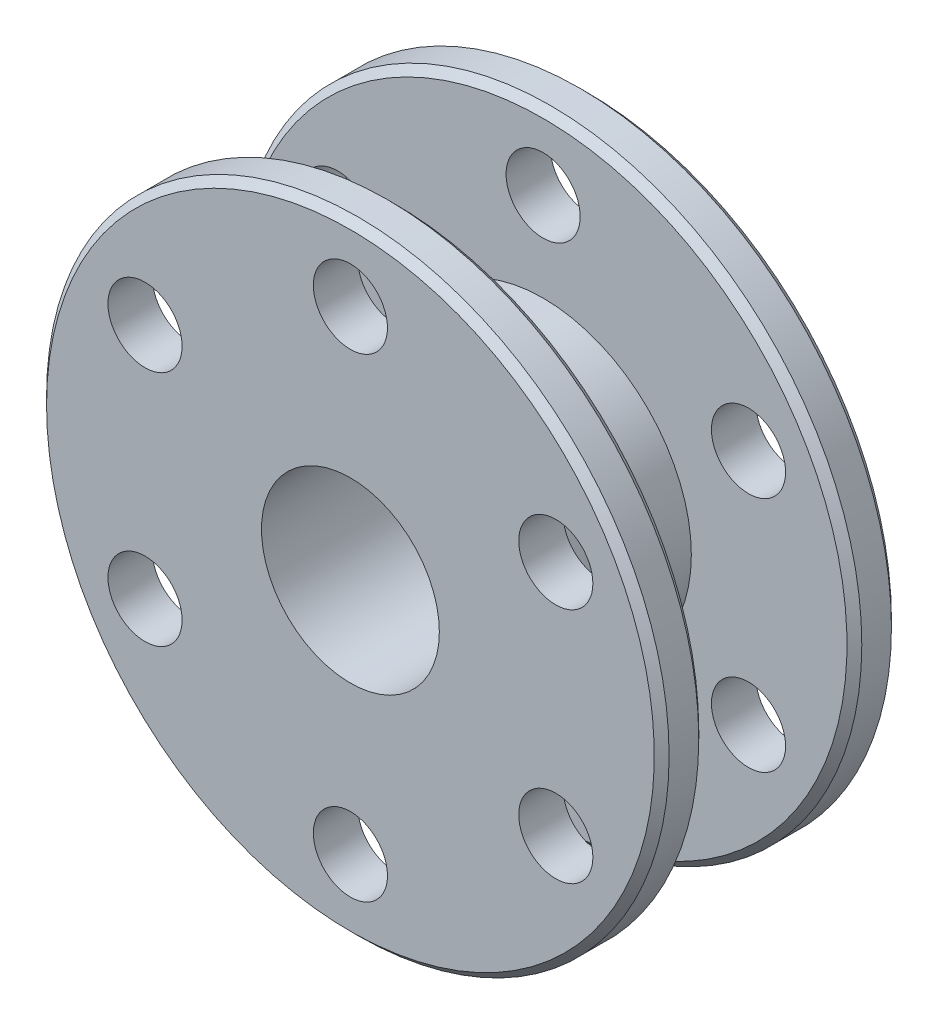
ISO-10303-21;
HEADER;
FILE_DESCRIPTION(('STEP AP214'),'2;1');
FILE_NAME('part.step','',(''),(''),'','','');
FILE_SCHEMA(('AUTOMOTIVE_DESIGN { 1 0 10303 214 1 1 1 1 }'));
ENDSEC;
DATA;
#1=APPLICATION_CONTEXT('core data for automotive mechanical design processes');
#2=APPLICATION_PROTOCOL_DEFINITION('international standard','automotive_design',2000,#1);
#3=PRODUCT_CONTEXT('',#1,'mechanical');
#4=PRODUCT('Part','Part','',(#3));
#5=PRODUCT_RELATED_PRODUCT_CATEGORY('part','',(#4));
#6=PRODUCT_DEFINITION_FORMATION('','',#4);
#7=PRODUCT_DEFINITION_CONTEXT('part definition',#1,'design');
#8=PRODUCT_DEFINITION('design','',#6,#7);
#9=PRODUCT_DEFINITION_SHAPE('','',#8);
#10=(LENGTH_UNIT() NAMED_UNIT(*) SI_UNIT(.MILLI.,.METRE.));
#11=(NAMED_UNIT(*) PLANE_ANGLE_UNIT() SI_UNIT($,.RADIAN.));
#12=(NAMED_UNIT(*) SI_UNIT($,.STERADIAN.) SOLID_ANGLE_UNIT());
#13=UNCERTAINTY_MEASURE_WITH_UNIT(LENGTH_MEASURE(1.E-05),#10,'distance_accuracy_value','');
#14=(GEOMETRIC_REPRESENTATION_CONTEXT(3) GLOBAL_UNCERTAINTY_ASSIGNED_CONTEXT((#13)) GLOBAL_UNIT_ASSIGNED_CONTEXT((#10,
#11,#12)) REPRESENTATION_CONTEXT('',''));
#15=CARTESIAN_POINT('',(0.,0.,0.));
#16=DIRECTION('',(0.,0.,1.));
#17=DIRECTION('',(1.,0.,0.));
#18=AXIS2_PLACEMENT_3D('',#15,#16,#17);
#19=CARTESIAN_POINT('',(0.,0.,24.7906816225651));
#20=DIRECTION('',(0.,0.,1.));
#21=DIRECTION('',(1.,0.,0.));
#22=AXIS2_PLACEMENT_3D('',#19,#20,#21);
#23=CYLINDRICAL_SURFACE('',#22,6.);
#24=CARTESIAN_POINT('',(0.,0.,-2.75139856854908));
#25=DIRECTION('',(0.,0.,1.));
#26=DIRECTION('',(1.,0.,0.));
#27=AXIS2_PLACEMENT_3D('',#24,#25,#26);
#28=CIRCLE('',#27,6.);
#29=CARTESIAN_POINT('',(6.,0.,-2.75139856854908));
#30=VERTEX_POINT('',#29);
#31=EDGE_CURVE('E77',#30,#30,#28,.T.);
#32=ORIENTED_EDGE('',*,*,#31,.F.);
#33=EDGE_LOOP('',(#32));
#34=FACE_BOUND('',#33,.T.);
#35=CARTESIAN_POINT('',(0.,0.,13.2486014314509));
#36=DIRECTION('',(0.,0.,1.));
#37=DIRECTION('',(1.,0.,0.));
#38=AXIS2_PLACEMENT_3D('',#35,#36,#37);
#39=CIRCLE('',#38,6.);
#40=CARTESIAN_POINT('',(6.,0.,13.2486014314509));
#41=VERTEX_POINT('',#40);
#42=EDGE_CURVE('E68',#41,#41,#39,.T.);
#43=ORIENTED_EDGE('',*,*,#42,.T.);
#44=EDGE_LOOP('',(#43));
#45=FACE_BOUND('',#44,.T.);
#46=ADVANCED_FACE('F35',(#34,#45),#23,.F.);
#47=CARTESIAN_POINT('',(0.,6.,13.2486014314509));
#48=DIRECTION('',(0.,0.,-1.));
#49=DIRECTION('',(-1.,0.,0.));
#50=AXIS2_PLACEMENT_3D('',#47,#48,#49);
#51=PLANE('',#50);
#52=CARTESIAN_POINT('',(0.,16.,13.2486014314509));
#53=DIRECTION('',(0.,0.,-1.));
#54=DIRECTION('',(-1.,0.,0.));
#55=AXIS2_PLACEMENT_3D('',#52,#53,#54);
#56=CIRCLE('',#55,2.5);
#57=CARTESIAN_POINT('',(-2.5,16.,13.2486014314509));
#58=VERTEX_POINT('',#57);
#59=EDGE_CURVE('E80',#58,#58,#56,.T.);
#60=ORIENTED_EDGE('',*,*,#59,.T.);
#61=EDGE_LOOP('',(#60));
#62=FACE_BOUND('',#61,.T.);
#63=CARTESIAN_POINT('',(-13.8564064605508,7.9999999999996,13.2486014314509));
#64=DIRECTION('',(0.,0.,-1.));
#65=DIRECTION('',(-1.,0.,0.));
#66=AXIS2_PLACEMENT_3D('',#63,#64,#65);
#67=CIRCLE('',#66,2.50000000000052);
#68=CARTESIAN_POINT('',(-16.3564064605513,7.9999999999996,13.2486014314509));
#69=VERTEX_POINT('',#68);
#70=EDGE_CURVE('E89',#69,#69,#67,.T.);
#71=ORIENTED_EDGE('',*,*,#70,.T.);
#72=EDGE_LOOP('',(#71));
#73=FACE_BOUND('',#72,.T.);
#74=CARTESIAN_POINT('',(-13.8564064605503,-8.0000000000004,13.2486014314509));
#75=DIRECTION('',(0.,0.,-1.));
#76=DIRECTION('',(-1.,0.,0.));
#77=AXIS2_PLACEMENT_3D('',#74,#75,#76);
#78=CIRCLE('',#77,2.50000000000091);
#79=CARTESIAN_POINT('',(-16.3564064605513,-8.0000000000004,13.2486014314509));
#80=VERTEX_POINT('',#79);
#81=EDGE_CURVE('E98',#80,#80,#78,.T.);
#82=ORIENTED_EDGE('',*,*,#81,.T.);
#83=EDGE_LOOP('',(#82));
#84=FACE_BOUND('',#83,.T.);
#85=CARTESIAN_POINT('',(9.03616397137021E-13,-16.,13.2486014314509));
#86=DIRECTION('',(0.,0.,-1.));
#87=DIRECTION('',(-1.,0.,0.));
#88=AXIS2_PLACEMENT_3D('',#85,#86,#87);
#89=CIRCLE('',#88,2.50000000000097);
#90=CARTESIAN_POINT('',(-2.50000000000007,-16.,13.2486014314509));
#91=VERTEX_POINT('',#90);
#92=EDGE_CURVE('E107',#91,#91,#89,.T.);
#93=ORIENTED_EDGE('',*,*,#92,.T.);
#94=EDGE_LOOP('',(#93));
#95=FACE_BOUND('',#94,.T.);
#96=CARTESIAN_POINT('',(13.8564064605517,-7.99999999999961,13.2486014314509));
#97=DIRECTION('',(0.,0.,-1.));
#98=DIRECTION('',(-1.,0.,0.));
#99=AXIS2_PLACEMENT_3D('',#96,#97,#98);
#100=CIRCLE('',#99,2.50000000000061);
#101=CARTESIAN_POINT('',(11.3564064605511,-7.99999999999961,13.2486014314509));
#102=VERTEX_POINT('',#101);
#103=EDGE_CURVE('E116',#102,#102,#100,.T.);
#104=ORIENTED_EDGE('',*,*,#103,.T.);
#105=EDGE_LOOP('',(#104));
#106=FACE_BOUND('',#105,.T.);
#107=CARTESIAN_POINT('',(13.8564064605512,8.0000000000004,13.2486014314509));
#108=DIRECTION('',(0.,0.,-1.));
#109=DIRECTION('',(-1.,0.,0.));
#110=AXIS2_PLACEMENT_3D('',#107,#108,#109);
#111=CIRCLE('',#110,2.50000000000014);
#112=CARTESIAN_POINT('',(11.3564064605511,8.0000000000004,13.2486014314509));
#113=VERTEX_POINT('',#112);
#114=EDGE_CURVE('E125',#113,#113,#111,.T.);
#115=ORIENTED_EDGE('',*,*,#114,.T.);
#116=EDGE_LOOP('',(#115));
#117=FACE_BOUND('',#116,.T.);
#118=CARTESIAN_POINT('',(0.,0.,13.2486014314509));
#119=DIRECTION('',(0.,0.,-1.));
#120=DIRECTION('',(-1.,0.,0.));
#121=AXIS2_PLACEMENT_3D('',#118,#119,#120);
#122=CIRCLE('',#121,20.5);
#123=CARTESIAN_POINT('',(-20.5,0.,13.2486014314509));
#124=VERTEX_POINT('',#123);
#125=EDGE_CURVE('E10',#124,#124,#122,.F.);
#126=ORIENTED_EDGE('',*,*,#125,.T.);
#127=EDGE_LOOP('',(#126));
#128=FACE_BOUND('',#127,.T.);
#129=ORIENTED_EDGE('',*,*,#42,.F.);
#130=EDGE_LOOP('',(#129));
#131=FACE_BOUND('',#130,.T.);
#132=ADVANCED_FACE('F197',(#62,#73,#84,#95,#106,#117,#128,#131),#51,.F.);
#133=CARTESIAN_POINT('',(0.,0.,24.7906816225651));
#134=DIRECTION('',(0.,0.,1.));
#135=DIRECTION('',(1.,0.,0.));
#136=AXIS2_PLACEMENT_3D('',#133,#134,#135);
#137=CYLINDRICAL_SURFACE('',#136,21.);
#138=CARTESIAN_POINT('',(0.,0.,10.7486014314509));
#139=DIRECTION('',(0.,0.,1.));
#140=DIRECTION('',(1.,0.,0.));
#141=AXIS2_PLACEMENT_3D('',#138,#139,#140);
#142=CIRCLE('',#141,21.);
#143=CARTESIAN_POINT('',(21.,0.,10.7486014314509));
#144=VERTEX_POINT('',#143);
#145=EDGE_CURVE('E47',#144,#144,#142,.T.);
#146=ORIENTED_EDGE('',*,*,#145,.T.);
#147=EDGE_LOOP('',(#146));
#148=FACE_BOUND('',#147,.T.);
#149=CARTESIAN_POINT('',(0.,0.,12.7486014314509));
#150=DIRECTION('',(0.,0.,-1.));
#151=DIRECTION('',(-1.,0.,0.));
#152=AXIS2_PLACEMENT_3D('',#149,#150,#151);
#153=CIRCLE('',#152,21.);
#154=CARTESIAN_POINT('',(-21.,0.,12.7486014314509));
#155=VERTEX_POINT('',#154);
#156=EDGE_CURVE('E51',#155,#155,#153,.T.);
#157=ORIENTED_EDGE('',*,*,#156,.T.);
#158=EDGE_LOOP('',(#157));
#159=FACE_BOUND('',#158,.T.);
#160=ADVANCED_FACE('F192',(#148,#159),#137,.T.);
#161=CARTESIAN_POINT('',(0.,21.,10.2486014314509));
#162=DIRECTION('',(0.,0.,1.));
#163=DIRECTION('',(1.,0.,0.));
#164=AXIS2_PLACEMENT_3D('',#161,#162,#163);
#165=PLANE('',#164);
#166=CARTESIAN_POINT('',(0.,16.,10.2486014314509));
#167=DIRECTION('',(0.,0.,1.));
#168=DIRECTION('',(1.,0.,0.));
#169=AXIS2_PLACEMENT_3D('',#166,#167,#168);
#170=CIRCLE('',#169,2.5);
#171=CARTESIAN_POINT('',(2.5,16.,10.2486014314509));
#172=VERTEX_POINT('',#171);
#173=EDGE_CURVE('E83',#172,#172,#170,.T.);
#174=ORIENTED_EDGE('',*,*,#173,.T.);
#175=EDGE_LOOP('',(#174));
#176=FACE_BOUND('',#175,.T.);
#177=CARTESIAN_POINT('',(-13.8564064605508,7.9999999999996,10.2486014314509));
#178=DIRECTION('',(0.,0.,1.));
#179=DIRECTION('',(1.,0.,0.));
#180=AXIS2_PLACEMENT_3D('',#177,#178,#179);
#181=CIRCLE('',#180,2.50000000000052);
#182=CARTESIAN_POINT('',(-11.3564064605503,7.9999999999996,10.2486014314509));
#183=VERTEX_POINT('',#182);
#184=EDGE_CURVE('E92',#183,#183,#181,.T.);
#185=ORIENTED_EDGE('',*,*,#184,.T.);
#186=EDGE_LOOP('',(#185));
#187=FACE_BOUND('',#186,.T.);
#188=CARTESIAN_POINT('',(-13.8564064605503,-8.0000000000004,10.2486014314509));
#189=DIRECTION('',(0.,0.,1.));
#190=DIRECTION('',(1.,0.,0.));
#191=AXIS2_PLACEMENT_3D('',#188,#189,#190);
#192=CIRCLE('',#191,2.50000000000091);
#193=CARTESIAN_POINT('',(-11.3564064605494,-8.0000000000004,10.2486014314509));
#194=VERTEX_POINT('',#193);
#195=EDGE_CURVE('E101',#194,#194,#192,.T.);
#196=ORIENTED_EDGE('',*,*,#195,.T.);
#197=EDGE_LOOP('',(#196));
#198=FACE_BOUND('',#197,.T.);
#199=CARTESIAN_POINT('',(9.03616397137021E-13,-16.,10.2486014314509));
#200=DIRECTION('',(0.,0.,1.));
#201=DIRECTION('',(1.,0.,0.));
#202=AXIS2_PLACEMENT_3D('',#199,#200,#201);
#203=CIRCLE('',#202,2.50000000000097);
#204=CARTESIAN_POINT('',(2.50000000000187,-16.,10.2486014314509));
#205=VERTEX_POINT('',#204);
#206=EDGE_CURVE('E110',#205,#205,#203,.T.);
#207=ORIENTED_EDGE('',*,*,#206,.T.);
#208=EDGE_LOOP('',(#207));
#209=FACE_BOUND('',#208,.T.);
#210=CARTESIAN_POINT('',(13.8564064605517,-7.99999999999961,10.2486014314509));
#211=DIRECTION('',(0.,0.,1.));
#212=DIRECTION('',(1.,0.,0.));
#213=AXIS2_PLACEMENT_3D('',#210,#211,#212);
#214=CIRCLE('',#213,2.50000000000061);
#215=CARTESIAN_POINT('',(16.3564064605523,-7.99999999999961,10.2486014314509));
#216=VERTEX_POINT('',#215);
#217=EDGE_CURVE('E119',#216,#216,#214,.T.);
#218=ORIENTED_EDGE('',*,*,#217,.T.);
#219=EDGE_LOOP('',(#218));
#220=FACE_BOUND('',#219,.T.);
#221=CARTESIAN_POINT('',(13.8564064605512,8.0000000000004,10.2486014314509));
#222=DIRECTION('',(0.,0.,1.));
#223=DIRECTION('',(1.,0.,0.));
#224=AXIS2_PLACEMENT_3D('',#221,#222,#223);
#225=CIRCLE('',#224,2.50000000000014);
#226=CARTESIAN_POINT('',(16.3564064605514,8.0000000000004,10.2486014314509));
#227=VERTEX_POINT('',#226);
#228=EDGE_CURVE('E128',#227,#227,#225,.T.);
#229=ORIENTED_EDGE('',*,*,#228,.T.);
#230=EDGE_LOOP('',(#229));
#231=FACE_BOUND('',#230,.T.);
#232=CARTESIAN_POINT('',(0.,0.,10.2486014314509));
#233=DIRECTION('',(0.,0.,1.));
#234=DIRECTION('',(1.,0.,0.));
#235=AXIS2_PLACEMENT_3D('',#232,#233,#234);
#236=CIRCLE('',#235,20.5);
#237=CARTESIAN_POINT('',(20.5,0.,10.2486014314509));
#238=VERTEX_POINT('',#237);
#239=EDGE_CURVE('E43',#238,#238,#236,.F.);
#240=ORIENTED_EDGE('',*,*,#239,.T.);
#241=EDGE_LOOP('',(#240));
#242=FACE_BOUND('',#241,.T.);
#243=CARTESIAN_POINT('',(0.,0.,10.2486014314509));
#244=DIRECTION('',(0.,0.,1.));
#245=DIRECTION('',(1.,0.,0.));
#246=AXIS2_PLACEMENT_3D('',#243,#244,#245);
#247=CIRCLE('',#246,10.);
#248=CARTESIAN_POINT('',(10.,0.,10.2486014314509));
#249=VERTEX_POINT('',#248);
#250=EDGE_CURVE('E71',#249,#249,#247,.T.);
#251=ORIENTED_EDGE('',*,*,#250,.T.);
#252=EDGE_LOOP('',(#251));
#253=FACE_BOUND('',#252,.T.);
#254=ADVANCED_FACE('F186',(#176,#187,#198,#209,#220,#231,#242,#253),#165,.F.);
#255=CARTESIAN_POINT('',(0.,0.,24.7906816225651));
#256=DIRECTION('',(0.,0.,1.));
#257=DIRECTION('',(1.,0.,0.));
#258=AXIS2_PLACEMENT_3D('',#255,#256,#257);
#259=CYLINDRICAL_SURFACE('',#258,10.);
#260=ORIENTED_EDGE('',*,*,#250,.F.);
#261=EDGE_LOOP('',(#260));
#262=FACE_BOUND('',#261,.T.);
#263=CARTESIAN_POINT('',(0.,0.,0.248601431450925));
#264=DIRECTION('',(0.,0.,1.));
#265=DIRECTION('',(1.,0.,0.));
#266=AXIS2_PLACEMENT_3D('',#263,#264,#265);
#267=CIRCLE('',#266,10.);
#268=CARTESIAN_POINT('',(10.,0.,0.248601431450925));
#269=VERTEX_POINT('',#268);
#270=EDGE_CURVE('E74',#269,#269,#267,.T.);
#271=ORIENTED_EDGE('',*,*,#270,.T.);
#272=EDGE_LOOP('',(#271));
#273=FACE_BOUND('',#272,.T.);
#274=ADVANCED_FACE('F169',(#262,#273),#259,.T.);
#275=CARTESIAN_POINT('',(0.,10.,0.248601431450924));
#276=DIRECTION('',(0.,0.,-1.));
#277=DIRECTION('',(-1.,0.,0.));
#278=AXIS2_PLACEMENT_3D('',#275,#276,#277);
#279=PLANE('',#278);
#280=CARTESIAN_POINT('',(0.,16.,0.248601431450924));
#281=DIRECTION('',(0.,0.,-1.));
#282=DIRECTION('',(-1.,0.,0.));
#283=AXIS2_PLACEMENT_3D('',#280,#281,#282);
#284=CIRCLE('',#283,2.5);
#285=CARTESIAN_POINT('',(-2.5,16.,0.248601431450924));
#286=VERTEX_POINT('',#285);
#287=EDGE_CURVE('E86',#286,#286,#284,.T.);
#288=ORIENTED_EDGE('',*,*,#287,.T.);
#289=EDGE_LOOP('',(#288));
#290=FACE_BOUND('',#289,.T.);
#291=CARTESIAN_POINT('',(-13.8564064605508,7.9999999999996,0.248601431450924));
#292=DIRECTION('',(0.,0.,-1.));
#293=DIRECTION('',(-1.,0.,0.));
#294=AXIS2_PLACEMENT_3D('',#291,#292,#293);
#295=CIRCLE('',#294,2.50000000000052);
#296=CARTESIAN_POINT('',(-16.3564064605513,7.9999999999996,0.248601431450924));
#297=VERTEX_POINT('',#296);
#298=EDGE_CURVE('E95',#297,#297,#295,.T.);
#299=ORIENTED_EDGE('',*,*,#298,.T.);
#300=EDGE_LOOP('',(#299));
#301=FACE_BOUND('',#300,.T.);
#302=CARTESIAN_POINT('',(-13.8564064605503,-8.0000000000004,0.248601431450924));
#303=DIRECTION('',(0.,0.,-1.));
#304=DIRECTION('',(-1.,0.,0.));
#305=AXIS2_PLACEMENT_3D('',#302,#303,#304);
#306=CIRCLE('',#305,2.50000000000091);
#307=CARTESIAN_POINT('',(-16.3564064605513,-8.0000000000004,0.248601431450924));
#308=VERTEX_POINT('',#307);
#309=EDGE_CURVE('E104',#308,#308,#306,.T.);
#310=ORIENTED_EDGE('',*,*,#309,.T.);
#311=EDGE_LOOP('',(#310));
#312=FACE_BOUND('',#311,.T.);
#313=CARTESIAN_POINT('',(9.03616397137021E-13,-16.,0.248601431450924));
#314=DIRECTION('',(0.,0.,-1.));
#315=DIRECTION('',(-1.,0.,0.));
#316=AXIS2_PLACEMENT_3D('',#313,#314,#315);
#317=CIRCLE('',#316,2.50000000000097);
#318=CARTESIAN_POINT('',(-2.50000000000007,-16.,0.248601431450924));
#319=VERTEX_POINT('',#318);
#320=EDGE_CURVE('E113',#319,#319,#317,.T.);
#321=ORIENTED_EDGE('',*,*,#320,.T.);
#322=EDGE_LOOP('',(#321));
#323=FACE_BOUND('',#322,.T.);
#324=CARTESIAN_POINT('',(13.8564064605517,-7.99999999999961,0.248601431450924));
#325=DIRECTION('',(0.,0.,-1.));
#326=DIRECTION('',(-1.,0.,0.));
#327=AXIS2_PLACEMENT_3D('',#324,#325,#326);
#328=CIRCLE('',#327,2.50000000000061);
#329=CARTESIAN_POINT('',(11.3564064605511,-7.99999999999961,0.248601431450924));
#330=VERTEX_POINT('',#329);
#331=EDGE_CURVE('E122',#330,#330,#328,.T.);
#332=ORIENTED_EDGE('',*,*,#331,.T.);
#333=EDGE_LOOP('',(#332));
#334=FACE_BOUND('',#333,.T.);
#335=CARTESIAN_POINT('',(13.8564064605512,8.0000000000004,0.248601431450924));
#336=DIRECTION('',(0.,0.,-1.));
#337=DIRECTION('',(-1.,0.,0.));
#338=AXIS2_PLACEMENT_3D('',#335,#336,#337);
#339=CIRCLE('',#338,2.50000000000014);
#340=CARTESIAN_POINT('',(11.3564064605511,8.0000000000004,0.248601431450924));
#341=VERTEX_POINT('',#340);
#342=EDGE_CURVE('E131',#341,#341,#339,.T.);
#343=ORIENTED_EDGE('',*,*,#342,.T.);
#344=EDGE_LOOP('',(#343));
#345=FACE_BOUND('',#344,.T.);
#346=CARTESIAN_POINT('',(0.,0.,0.248601431450924));
#347=DIRECTION('',(0.,0.,-1.));
#348=DIRECTION('',(-1.,0.,0.));
#349=AXIS2_PLACEMENT_3D('',#346,#347,#348);
#350=CIRCLE('',#349,20.5);
#351=CARTESIAN_POINT('',(-20.5,0.,0.248601431450924));
#352=VERTEX_POINT('',#351);
#353=EDGE_CURVE('E56',#352,#352,#350,.F.);
#354=ORIENTED_EDGE('',*,*,#353,.T.);
#355=EDGE_LOOP('',(#354));
#356=FACE_BOUND('',#355,.T.);
#357=ORIENTED_EDGE('',*,*,#270,.F.);
#358=EDGE_LOOP('',(#357));
#359=FACE_BOUND('',#358,.T.);
#360=ADVANCED_FACE('F165',(#290,#301,#312,#323,#334,#345,#356,#359),#279,.F.);
#361=CARTESIAN_POINT('',(0.,0.,24.7906816225651));
#362=DIRECTION('',(0.,0.,1.));
#363=DIRECTION('',(1.,0.,0.));
#364=AXIS2_PLACEMENT_3D('',#361,#362,#363);
#365=CYLINDRICAL_SURFACE('',#364,21.);
#366=CARTESIAN_POINT('',(0.,0.,-2.25139856854908));
#367=DIRECTION('',(0.,0.,1.));
#368=DIRECTION('',(1.,0.,0.));
#369=AXIS2_PLACEMENT_3D('',#366,#367,#368);
#370=CIRCLE('',#369,21.);
#371=CARTESIAN_POINT('',(21.,0.,-2.25139856854908));
#372=VERTEX_POINT('',#371);
#373=EDGE_CURVE('E62',#372,#372,#370,.T.);
#374=ORIENTED_EDGE('',*,*,#373,.T.);
#375=EDGE_LOOP('',(#374));
#376=FACE_BOUND('',#375,.T.);
#377=CARTESIAN_POINT('',(0.,0.,-0.251398568549093));
#378=DIRECTION('',(0.,0.,-1.));
#379=DIRECTION('',(-1.,0.,0.));
#380=AXIS2_PLACEMENT_3D('',#377,#378,#379);
#381=CIRCLE('',#380,21.);
#382=CARTESIAN_POINT('',(-21.,0.,-0.251398568549093));
#383=VERTEX_POINT('',#382);
#384=EDGE_CURVE('E65',#383,#383,#381,.T.);
#385=ORIENTED_EDGE('',*,*,#384,.T.);
#386=EDGE_LOOP('',(#385));
#387=FACE_BOUND('',#386,.T.);
#388=ADVANCED_FACE('F168',(#376,#387),#365,.T.);
#389=CARTESIAN_POINT('',(0.,21.,-2.75139856854908));
#390=DIRECTION('',(0.,0.,1.));
#391=DIRECTION('',(1.,0.,0.));
#392=AXIS2_PLACEMENT_3D('',#389,#390,#391);
#393=PLANE('',#392);
#394=CARTESIAN_POINT('',(0.,16.,-2.75139856854908));
#395=DIRECTION('',(0.,0.,1.));
#396=DIRECTION('',(1.,0.,0.));
#397=AXIS2_PLACEMENT_3D('',#394,#395,#396);
#398=CIRCLE('',#397,2.5);
#399=CARTESIAN_POINT('',(2.5,16.,-2.75139856854908));
#400=VERTEX_POINT('',#399);
#401=EDGE_CURVE('E134',#400,#400,#398,.T.);
#402=ORIENTED_EDGE('',*,*,#401,.T.);
#403=EDGE_LOOP('',(#402));
#404=FACE_BOUND('',#403,.T.);
#405=CARTESIAN_POINT('',(-13.8564064605508,7.9999999999996,-2.75139856854908));
#406=DIRECTION('',(0.,0.,1.));
#407=DIRECTION('',(1.,0.,0.));
#408=AXIS2_PLACEMENT_3D('',#405,#406,#407);
#409=CIRCLE('',#408,2.50000000000052);
#410=CARTESIAN_POINT('',(-11.3564064605503,7.9999999999996,-2.75139856854908));
#411=VERTEX_POINT('',#410);
#412=EDGE_CURVE('E139',#411,#411,#409,.T.);
#413=ORIENTED_EDGE('',*,*,#412,.T.);
#414=EDGE_LOOP('',(#413));
#415=FACE_BOUND('',#414,.T.);
#416=CARTESIAN_POINT('',(-13.8564064605503,-8.0000000000004,-2.75139856854908));
#417=DIRECTION('',(0.,0.,1.));
#418=DIRECTION('',(1.,0.,0.));
#419=AXIS2_PLACEMENT_3D('',#416,#417,#418);
#420=CIRCLE('',#419,2.50000000000091);
#421=CARTESIAN_POINT('',(-11.3564064605494,-8.0000000000004,-2.75139856854908));
#422=VERTEX_POINT('',#421);
#423=EDGE_CURVE('E135',#422,#422,#420,.T.);
#424=ORIENTED_EDGE('',*,*,#423,.T.);
#425=EDGE_LOOP('',(#424));
#426=FACE_BOUND('',#425,.T.);
#427=CARTESIAN_POINT('',(9.03616397137021E-13,-16.,-2.75139856854908));
#428=DIRECTION('',(0.,0.,1.));
#429=DIRECTION('',(1.,0.,0.));
#430=AXIS2_PLACEMENT_3D('',#427,#428,#429);
#431=CIRCLE('',#430,2.50000000000097);
#432=CARTESIAN_POINT('',(2.50000000000187,-16.,-2.75139856854908));
#433=VERTEX_POINT('',#432);
#434=EDGE_CURVE('E138',#433,#433,#431,.T.);
#435=ORIENTED_EDGE('',*,*,#434,.T.);
#436=EDGE_LOOP('',(#435));
#437=FACE_BOUND('',#436,.T.);
#438=CARTESIAN_POINT('',(13.8564064605517,-7.99999999999961,-2.75139856854908));
#439=DIRECTION('',(0.,0.,1.));
#440=DIRECTION('',(1.,0.,0.));
#441=AXIS2_PLACEMENT_3D('',#438,#439,#440);
#442=CIRCLE('',#441,2.50000000000061);
#443=CARTESIAN_POINT('',(16.3564064605523,-7.99999999999961,-2.75139856854908));
#444=VERTEX_POINT('',#443);
#445=EDGE_CURVE('E142',#444,#444,#442,.T.);
#446=ORIENTED_EDGE('',*,*,#445,.T.);
#447=EDGE_LOOP('',(#446));
#448=FACE_BOUND('',#447,.T.);
#449=CARTESIAN_POINT('',(13.8564064605512,8.0000000000004,-2.75139856854908));
#450=DIRECTION('',(0.,0.,1.));
#451=DIRECTION('',(1.,0.,0.));
#452=AXIS2_PLACEMENT_3D('',#449,#450,#451);
#453=CIRCLE('',#452,2.50000000000014);
#454=CARTESIAN_POINT('',(16.3564064605514,8.0000000000004,-2.75139856854908));
#455=VERTEX_POINT('',#454);
#456=EDGE_CURVE('E145',#455,#455,#453,.T.);
#457=ORIENTED_EDGE('',*,*,#456,.T.);
#458=EDGE_LOOP('',(#457));
#459=FACE_BOUND('',#458,.T.);
#460=CARTESIAN_POINT('',(0.,0.,-2.75139856854908));
#461=DIRECTION('',(0.,0.,1.));
#462=DIRECTION('',(1.,0.,0.));
#463=AXIS2_PLACEMENT_3D('',#460,#461,#462);
#464=CIRCLE('',#463,20.5);
#465=CARTESIAN_POINT('',(20.5,0.,-2.75139856854908));
#466=VERTEX_POINT('',#465);
#467=EDGE_CURVE('E59',#466,#466,#464,.F.);
#468=ORIENTED_EDGE('',*,*,#467,.T.);
#469=EDGE_LOOP('',(#468));
#470=FACE_BOUND('',#469,.T.);
#471=ORIENTED_EDGE('',*,*,#31,.T.);
#472=EDGE_LOOP('',(#471));
#473=FACE_BOUND('',#472,.T.);
#474=ADVANCED_FACE('F153',(#404,#415,#426,#437,#448,#459,#470,#473),#393,.F.);
#475=CARTESIAN_POINT('',(0.,0.,-2.25139856854908));
#476=DIRECTION('',(0.,0.,1.));
#477=DIRECTION('',(1.,0.,0.));
#478=AXIS2_PLACEMENT_3D('',#475,#476,#477);
#479=CONICAL_SURFACE('',#478,21.,0.785398163397448);
#480=ORIENTED_EDGE('',*,*,#467,.F.);
#481=EDGE_LOOP('',(#480));
#482=FACE_BOUND('',#481,.T.);
#483=ORIENTED_EDGE('',*,*,#373,.F.);
#484=EDGE_LOOP('',(#483));
#485=FACE_BOUND('',#484,.T.);
#486=ADVANCED_FACE('F210',(#482,#485),#479,.T.);
#487=CARTESIAN_POINT('',(0.,0.,0.248601431450925));
#488=DIRECTION('',(0.,0.,-1.));
#489=DIRECTION('',(-1.,0.,0.));
#490=AXIS2_PLACEMENT_3D('',#487,#488,#489);
#491=CONICAL_SURFACE('',#490,20.5,0.785398163397448);
#492=ORIENTED_EDGE('',*,*,#384,.F.);
#493=EDGE_LOOP('',(#492));
#494=FACE_BOUND('',#493,.T.);
#495=ORIENTED_EDGE('',*,*,#353,.F.);
#496=EDGE_LOOP('',(#495));
#497=FACE_BOUND('',#496,.T.);
#498=ADVANCED_FACE('F216',(#494,#497),#491,.T.);
#499=CARTESIAN_POINT('',(0.,0.,10.7486014314509));
#500=DIRECTION('',(0.,0.,1.));
#501=DIRECTION('',(1.,0.,0.));
#502=AXIS2_PLACEMENT_3D('',#499,#500,#501);
#503=CONICAL_SURFACE('',#502,21.,0.785398163397448);
#504=ORIENTED_EDGE('',*,*,#239,.F.);
#505=EDGE_LOOP('',(#504));
#506=FACE_BOUND('',#505,.T.);
#507=ORIENTED_EDGE('',*,*,#145,.F.);
#508=EDGE_LOOP('',(#507));
#509=FACE_BOUND('',#508,.T.);
#510=ADVANCED_FACE('F222',(#506,#509),#503,.T.);
#511=CARTESIAN_POINT('',(0.,0.,13.2486014314509));
#512=DIRECTION('',(0.,0.,-1.));
#513=DIRECTION('',(-1.,0.,0.));
#514=AXIS2_PLACEMENT_3D('',#511,#512,#513);
#515=CONICAL_SURFACE('',#514,20.5,0.785398163397448);
#516=ORIENTED_EDGE('',*,*,#156,.F.);
#517=EDGE_LOOP('',(#516));
#518=FACE_BOUND('',#517,.T.);
#519=ORIENTED_EDGE('',*,*,#125,.F.);
#520=EDGE_LOOP('',(#519));
#521=FACE_BOUND('',#520,.T.);
#522=ADVANCED_FACE('F38',(#518,#521),#515,.T.);
#523=CARTESIAN_POINT('',(13.8564064605512,8.0000000000004,-2.75139856854908));
#524=DIRECTION('',(0.,0.,1.));
#525=DIRECTION('',(1.,0.,0.));
#526=AXIS2_PLACEMENT_3D('',#523,#524,#525);
#527=CYLINDRICAL_SURFACE('',#526,2.50000000000014);
#528=ORIENTED_EDGE('',*,*,#456,.F.);
#529=EDGE_LOOP('',(#528));
#530=FACE_BOUND('',#529,.T.);
#531=ORIENTED_EDGE('',*,*,#342,.F.);
#532=EDGE_LOOP('',(#531));
#533=FACE_BOUND('',#532,.T.);
#534=ADVANCED_FACE('F231',(#530,#533),#527,.F.);
#535=CARTESIAN_POINT('',(13.8564064605517,-7.99999999999961,-2.75139856854908));
#536=DIRECTION('',(0.,0.,1.));
#537=DIRECTION('',(1.,0.,0.));
#538=AXIS2_PLACEMENT_3D('',#535,#536,#537);
#539=CYLINDRICAL_SURFACE('',#538,2.50000000000061);
#540=ORIENTED_EDGE('',*,*,#445,.F.);
#541=EDGE_LOOP('',(#540));
#542=FACE_BOUND('',#541,.T.);
#543=ORIENTED_EDGE('',*,*,#331,.F.);
#544=EDGE_LOOP('',(#543));
#545=FACE_BOUND('',#544,.T.);
#546=ADVANCED_FACE('F279',(#542,#545),#539,.F.);
#547=CARTESIAN_POINT('',(9.03616397137021E-13,-16.,-2.75139856854908));
#548=DIRECTION('',(0.,0.,1.));
#549=DIRECTION('',(1.,0.,0.));
#550=AXIS2_PLACEMENT_3D('',#547,#548,#549);
#551=CYLINDRICAL_SURFACE('',#550,2.50000000000097);
#552=ORIENTED_EDGE('',*,*,#434,.F.);
#553=EDGE_LOOP('',(#552));
#554=FACE_BOUND('',#553,.T.);
#555=ORIENTED_EDGE('',*,*,#320,.F.);
#556=EDGE_LOOP('',(#555));
#557=FACE_BOUND('',#556,.T.);
#558=ADVANCED_FACE('F290',(#554,#557),#551,.F.);
#559=CARTESIAN_POINT('',(-13.8564064605503,-8.0000000000004,-2.75139856854908));
#560=DIRECTION('',(0.,0.,1.));
#561=DIRECTION('',(1.,0.,0.));
#562=AXIS2_PLACEMENT_3D('',#559,#560,#561);
#563=CYLINDRICAL_SURFACE('',#562,2.50000000000091);
#564=ORIENTED_EDGE('',*,*,#423,.F.);
#565=EDGE_LOOP('',(#564));
#566=FACE_BOUND('',#565,.T.);
#567=ORIENTED_EDGE('',*,*,#309,.F.);
#568=EDGE_LOOP('',(#567));
#569=FACE_BOUND('',#568,.T.);
#570=ADVANCED_FACE('F301',(#566,#569),#563,.F.);
#571=CARTESIAN_POINT('',(-13.8564064605508,7.9999999999996,-2.75139856854908));
#572=DIRECTION('',(0.,0.,1.));
#573=DIRECTION('',(1.,0.,0.));
#574=AXIS2_PLACEMENT_3D('',#571,#572,#573);
#575=CYLINDRICAL_SURFACE('',#574,2.50000000000052);
#576=ORIENTED_EDGE('',*,*,#412,.F.);
#577=EDGE_LOOP('',(#576));
#578=FACE_BOUND('',#577,.T.);
#579=ORIENTED_EDGE('',*,*,#298,.F.);
#580=EDGE_LOOP('',(#579));
#581=FACE_BOUND('',#580,.T.);
#582=ADVANCED_FACE('F160',(#578,#581),#575,.F.);
#583=CARTESIAN_POINT('',(0.,16.,-2.75139856854908));
#584=DIRECTION('',(0.,0.,1.));
#585=DIRECTION('',(1.,0.,0.));
#586=AXIS2_PLACEMENT_3D('',#583,#584,#585);
#587=CYLINDRICAL_SURFACE('',#586,2.5);
#588=ORIENTED_EDGE('',*,*,#401,.F.);
#589=EDGE_LOOP('',(#588));
#590=FACE_BOUND('',#589,.T.);
#591=ORIENTED_EDGE('',*,*,#287,.F.);
#592=EDGE_LOOP('',(#591));
#593=FACE_BOUND('',#592,.T.);
#594=ADVANCED_FACE('F156',(#590,#593),#587,.F.);
#595=ORIENTED_EDGE('',*,*,#228,.F.);
#596=EDGE_LOOP('',(#595));
#597=FACE_BOUND('',#596,.T.);
#598=ORIENTED_EDGE('',*,*,#114,.F.);
#599=EDGE_LOOP('',(#598));
#600=FACE_BOUND('',#599,.T.);
#601=ADVANCED_FACE('F159',(#597,#600),#527,.F.);
#602=ORIENTED_EDGE('',*,*,#217,.F.);
#603=EDGE_LOOP('',(#602));
#604=FACE_BOUND('',#603,.T.);
#605=ORIENTED_EDGE('',*,*,#103,.F.);
#606=EDGE_LOOP('',(#605));
#607=FACE_BOUND('',#606,.T.);
#608=ADVANCED_FACE('F293',(#604,#607),#539,.F.);
#609=ORIENTED_EDGE('',*,*,#206,.F.);
#610=EDGE_LOOP('',(#609));
#611=FACE_BOUND('',#610,.T.);
#612=ORIENTED_EDGE('',*,*,#92,.F.);
#613=EDGE_LOOP('',(#612));
#614=FACE_BOUND('',#613,.T.);
#615=ADVANCED_FACE('F304',(#611,#614),#551,.F.);
#616=ORIENTED_EDGE('',*,*,#195,.F.);
#617=EDGE_LOOP('',(#616));
#618=FACE_BOUND('',#617,.T.);
#619=ORIENTED_EDGE('',*,*,#81,.F.);
#620=EDGE_LOOP('',(#619));
#621=FACE_BOUND('',#620,.T.);
#622=ADVANCED_FACE('F314',(#618,#621),#563,.F.);
#623=ORIENTED_EDGE('',*,*,#184,.F.);
#624=EDGE_LOOP('',(#623));
#625=FACE_BOUND('',#624,.T.);
#626=ORIENTED_EDGE('',*,*,#70,.F.);
#627=EDGE_LOOP('',(#626));
#628=FACE_BOUND('',#627,.T.);
#629=ADVANCED_FACE('F324',(#625,#628),#575,.F.);
#630=ORIENTED_EDGE('',*,*,#173,.F.);
#631=EDGE_LOOP('',(#630));
#632=FACE_BOUND('',#631,.T.);
#633=ORIENTED_EDGE('',*,*,#59,.F.);
#634=EDGE_LOOP('',(#633));
#635=FACE_BOUND('',#634,.T.);
#636=ADVANCED_FACE('F162',(#632,#635),#587,.F.);
#637=CLOSED_SHELL('',(#46,#132,#160,#254,#274,#360,#388,#474,#486,#498,#510,#522,#534,#546,#558,
#570,#582,#594,#601,#608,#615,#622,#629,#636));
#638=MANIFOLD_SOLID_BREP('B2',#637);
#639=ADVANCED_BREP_SHAPE_REPRESENTATION('',(#18,#638),#14);
#640=SHAPE_DEFINITION_REPRESENTATION(#9,#639);
ENDSEC;
END-ISO-10303-21;
